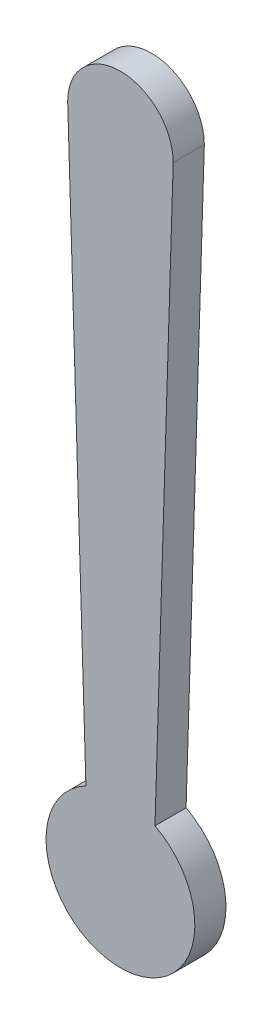
ISO-10303-21;
HEADER;
FILE_DESCRIPTION(('STEP AP214'),'2;1');
FILE_NAME('part.step','',(''),(''),'','','');
FILE_SCHEMA(('AUTOMOTIVE_DESIGN { 1 0 10303 214 1 1 1 1 }'));
ENDSEC;
DATA;
#1=APPLICATION_CONTEXT('core data for automotive mechanical design processes');
#2=APPLICATION_PROTOCOL_DEFINITION('international standard','automotive_design',2000,#1);
#3=PRODUCT_CONTEXT('',#1,'mechanical');
#4=PRODUCT('Part','Part','',(#3));
#5=PRODUCT_RELATED_PRODUCT_CATEGORY('part','',(#4));
#6=PRODUCT_DEFINITION_FORMATION('','',#4);
#7=PRODUCT_DEFINITION_CONTEXT('part definition',#1,'design');
#8=PRODUCT_DEFINITION('design','',#6,#7);
#9=PRODUCT_DEFINITION_SHAPE('','',#8);
#10=(LENGTH_UNIT() NAMED_UNIT(*) SI_UNIT(.MILLI.,.METRE.));
#11=(NAMED_UNIT(*) PLANE_ANGLE_UNIT() SI_UNIT($,.RADIAN.));
#12=(NAMED_UNIT(*) SI_UNIT($,.STERADIAN.) SOLID_ANGLE_UNIT());
#13=UNCERTAINTY_MEASURE_WITH_UNIT(LENGTH_MEASURE(1.E-05),#10,'distance_accuracy_value','');
#14=(GEOMETRIC_REPRESENTATION_CONTEXT(3) GLOBAL_UNCERTAINTY_ASSIGNED_CONTEXT((#13)) GLOBAL_UNIT_ASSIGNED_CONTEXT((#10,
#11,#12)) REPRESENTATION_CONTEXT('',''));
#15=CARTESIAN_POINT('',(0.,0.,0.));
#16=DIRECTION('',(0.,0.,1.));
#17=DIRECTION('',(1.,0.,0.));
#18=AXIS2_PLACEMENT_3D('',#15,#16,#17);
#19=CARTESIAN_POINT('',(0.,120.,11.5));
#20=DIRECTION('',(0.,0.,-1.));
#21=DIRECTION('',(-1.,0.,0.));
#22=AXIS2_PLACEMENT_3D('',#19,#20,#21);
#23=CYLINDRICAL_SURFACE('',#22,19.5);
#24=CARTESIAN_POINT('',(0.,120.,0.));
#25=DIRECTION('',(0.,0.,1.));
#26=DIRECTION('',(1.,0.,0.));
#27=AXIS2_PLACEMENT_3D('',#24,#25,#26);
#28=CIRCLE('',#27,19.5);
#29=CARTESIAN_POINT('',(19.5,120.,0.));
#30=VERTEX_POINT('',#29);
#31=CARTESIAN_POINT('',(-19.5,120.,0.));
#32=VERTEX_POINT('',#31);
#33=EDGE_CURVE('E111',#30,#32,#28,.T.);
#34=ORIENTED_EDGE('',*,*,#33,.T.);
#35=DIRECTION('',(0.,0.,-1.));
#36=VECTOR('',#35,1.);
#37=CARTESIAN_POINT('',(-19.5,120.,11.5));
#38=LINE('',#37,#36);
#39=CARTESIAN_POINT('',(-19.5,120.,11.5));
#40=VERTEX_POINT('',#39);
#41=EDGE_CURVE('E66',#40,#32,#38,.T.);
#42=ORIENTED_EDGE('',*,*,#41,.F.);
#43=CARTESIAN_POINT('',(0.,120.,11.5));
#44=DIRECTION('',(0.,0.,1.));
#45=DIRECTION('',(1.,0.,0.));
#46=AXIS2_PLACEMENT_3D('',#43,#44,#45);
#47=CIRCLE('',#46,19.5);
#48=CARTESIAN_POINT('',(19.5,120.,11.5));
#49=VERTEX_POINT('',#48);
#50=EDGE_CURVE('E101',#49,#40,#47,.T.);
#51=ORIENTED_EDGE('',*,*,#50,.F.);
#52=DIRECTION('',(0.,0.,-1.));
#53=VECTOR('',#52,1.);
#54=CARTESIAN_POINT('',(19.5,120.,11.5));
#55=LINE('',#54,#53);
#56=EDGE_CURVE('E12',#49,#30,#55,.T.);
#57=ORIENTED_EDGE('',*,*,#56,.T.);
#58=EDGE_LOOP('',(#34,#42,#51,#57));
#59=FACE_BOUND('',#58,.T.);
#60=ADVANCED_FACE('F56',(#59),#23,.T.);
#61=CARTESIAN_POINT('',(-15.7346341463415,-0.491707317073174,11.5));
#62=DIRECTION('',(0.999512076087079,0.0312347523777214,0.));
#63=DIRECTION('',(-0.0312347523777214,0.999512076087079,0.));
#64=AXIS2_PLACEMENT_3D('',#61,#62,#63);
#65=PLANE('',#64);
#66=DIRECTION('',(0.0312347523777214,-0.999512076087079,0.));
#67=VECTOR('',#66,1.);
#68=CARTESIAN_POINT('',(-15.7346341463415,-0.491707317073174,0.));
#69=LINE('',#68,#67);
#70=CARTESIAN_POINT('',(-12.7612442560825,-95.6401838053609,0.));
#71=VERTEX_POINT('',#70);
#72=EDGE_CURVE('E126',#32,#71,#69,.T.);
#73=ORIENTED_EDGE('',*,*,#72,.T.);
#74=DIRECTION('',(0.,0.,-1.));
#75=VECTOR('',#74,1.);
#76=CARTESIAN_POINT('',(-12.7612442560825,-95.6401838053609,11.5));
#77=LINE('',#76,#75);
#78=CARTESIAN_POINT('',(-12.7612442560825,-95.6401838053609,11.5));
#79=VERTEX_POINT('',#78);
#80=EDGE_CURVE('E88',#79,#71,#77,.T.);
#81=ORIENTED_EDGE('',*,*,#80,.F.);
#82=DIRECTION('',(0.0312347523777214,-0.999512076087079,0.));
#83=VECTOR('',#82,1.);
#84=CARTESIAN_POINT('',(-15.7346341463415,-0.491707317073174,11.5));
#85=LINE('',#84,#83);
#86=EDGE_CURVE('E105',#40,#79,#85,.T.);
#87=ORIENTED_EDGE('',*,*,#86,.F.);
#88=ORIENTED_EDGE('',*,*,#41,.T.);
#89=EDGE_LOOP('',(#73,#81,#87,#88));
#90=FACE_BOUND('',#89,.T.);
#91=ADVANCED_FACE('F116',(#90),#65,.F.);
#92=CARTESIAN_POINT('',(15.7346341463415,-0.491707317073174,11.5));
#93=DIRECTION('',(0.999512076087079,-0.0312347523777214,0.));
#94=DIRECTION('',(0.0312347523777214,0.999512076087079,0.));
#95=AXIS2_PLACEMENT_3D('',#92,#93,#94);
#96=PLANE('',#95);
#97=DIRECTION('',(-0.0312347523777214,-0.999512076087079,0.));
#98=VECTOR('',#97,1.);
#99=CARTESIAN_POINT('',(15.7346341463415,-0.491707317073174,0.));
#100=LINE('',#99,#98);
#101=CARTESIAN_POINT('',(12.7612442560825,-95.6401838053609,0.));
#102=VERTEX_POINT('',#101);
#103=EDGE_CURVE('E121',#30,#102,#100,.T.);
#104=ORIENTED_EDGE('',*,*,#103,.F.);
#105=ORIENTED_EDGE('',*,*,#56,.F.);
#106=DIRECTION('',(-0.0312347523777214,-0.999512076087079,0.));
#107=VECTOR('',#106,1.);
#108=CARTESIAN_POINT('',(15.7346341463415,-0.491707317073174,11.5));
#109=LINE('',#108,#107);
#110=CARTESIAN_POINT('',(12.7612442560825,-95.6401838053609,11.5));
#111=VERTEX_POINT('',#110);
#112=EDGE_CURVE('E106',#49,#111,#109,.T.);
#113=ORIENTED_EDGE('',*,*,#112,.T.);
#114=DIRECTION('',(0.,0.,-1.));
#115=VECTOR('',#114,1.);
#116=CARTESIAN_POINT('',(12.7612442560825,-95.6401838053609,11.5));
#117=LINE('',#116,#115);
#118=EDGE_CURVE('E75',#111,#102,#117,.T.);
#119=ORIENTED_EDGE('',*,*,#118,.T.);
#120=EDGE_LOOP('',(#104,#105,#113,#119));
#121=FACE_BOUND('',#120,.T.);
#122=ADVANCED_FACE('F130',(#121),#96,.T.);
#123=CARTESIAN_POINT('',(0.,0.,0.));
#124=DIRECTION('',(0.,0.,1.));
#125=DIRECTION('',(1.,0.,0.));
#126=AXIS2_PLACEMENT_3D('',#123,#124,#125);
#127=PLANE('',#126);
#128=ORIENTED_EDGE('',*,*,#103,.T.);
#129=CARTESIAN_POINT('',(0.,-120.,0.));
#130=DIRECTION('',(0.,0.,1.));
#131=DIRECTION('',(1.,0.,0.));
#132=AXIS2_PLACEMENT_3D('',#129,#130,#131);
#133=CIRCLE('',#132,27.5);
#134=EDGE_CURVE('E60',#71,#102,#133,.T.);
#135=ORIENTED_EDGE('',*,*,#134,.F.);
#136=ORIENTED_EDGE('',*,*,#72,.F.);
#137=ORIENTED_EDGE('',*,*,#33,.F.);
#138=EDGE_LOOP('',(#128,#135,#136,#137));
#139=FACE_BOUND('',#138,.T.);
#140=ADVANCED_FACE('F129',(#139),#127,.F.);
#141=CARTESIAN_POINT('',(0.,0.,11.5));
#142=DIRECTION('',(0.,0.,1.));
#143=DIRECTION('',(1.,0.,0.));
#144=AXIS2_PLACEMENT_3D('',#141,#142,#143);
#145=PLANE('',#144);
#146=ORIENTED_EDGE('',*,*,#112,.F.);
#147=ORIENTED_EDGE('',*,*,#50,.T.);
#148=ORIENTED_EDGE('',*,*,#86,.T.);
#149=CARTESIAN_POINT('',(0.,-120.,11.5));
#150=DIRECTION('',(0.,0.,1.));
#151=DIRECTION('',(1.,0.,0.));
#152=AXIS2_PLACEMENT_3D('',#149,#150,#151);
#153=CIRCLE('',#152,27.5);
#154=EDGE_CURVE('E124',#79,#111,#153,.T.);
#155=ORIENTED_EDGE('',*,*,#154,.T.);
#156=EDGE_LOOP('',(#146,#147,#148,#155));
#157=FACE_BOUND('',#156,.T.);
#158=ADVANCED_FACE('F103',(#157),#145,.T.);
#159=CARTESIAN_POINT('',(0.,-120.,11.5));
#160=DIRECTION('',(0.,0.,-1.));
#161=DIRECTION('',(-1.,0.,0.));
#162=AXIS2_PLACEMENT_3D('',#159,#160,#161);
#163=CYLINDRICAL_SURFACE('',#162,27.5);
#164=ORIENTED_EDGE('',*,*,#118,.F.);
#165=ORIENTED_EDGE('',*,*,#154,.F.);
#166=ORIENTED_EDGE('',*,*,#80,.T.);
#167=ORIENTED_EDGE('',*,*,#134,.T.);
#168=EDGE_LOOP('',(#164,#165,#166,#167));
#169=FACE_BOUND('',#168,.T.);
#170=ADVANCED_FACE('F58',(#169),#163,.T.);
#171=CLOSED_SHELL('',(#60,#91,#122,#140,#158,#170));
#172=MANIFOLD_SOLID_BREP('B2',#171);
#173=ADVANCED_BREP_SHAPE_REPRESENTATION('',(#18,#172),#14);
#174=SHAPE_DEFINITION_REPRESENTATION(#9,#173);
ENDSEC;
END-ISO-10303-21;
